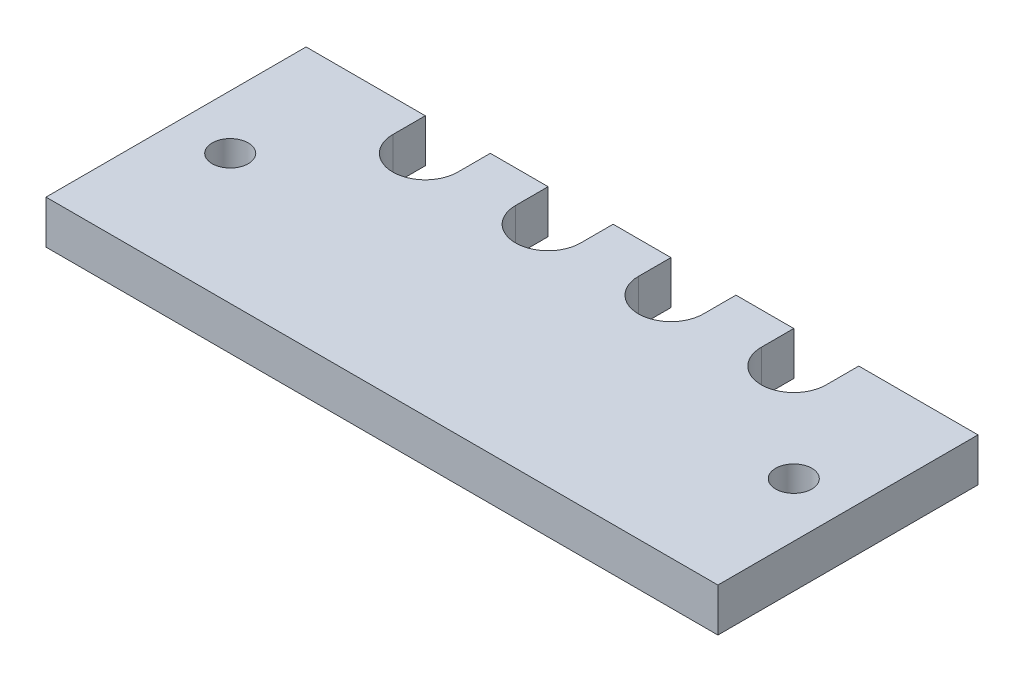
ISO-10303-21;
HEADER;
FILE_DESCRIPTION(('STEP AP214'),'2;1');
FILE_NAME('part.step','',(''),(''),'','','');
FILE_SCHEMA(('AUTOMOTIVE_DESIGN { 1 0 10303 214 1 1 1 1 }'));
ENDSEC;
DATA;
#1=APPLICATION_CONTEXT('core data for automotive mechanical design processes');
#2=APPLICATION_PROTOCOL_DEFINITION('international standard','automotive_design',2000,#1);
#3=PRODUCT_CONTEXT('',#1,'mechanical');
#4=PRODUCT('Part','Part','',(#3));
#5=PRODUCT_RELATED_PRODUCT_CATEGORY('part','',(#4));
#6=PRODUCT_DEFINITION_FORMATION('','',#4);
#7=PRODUCT_DEFINITION_CONTEXT('part definition',#1,'design');
#8=PRODUCT_DEFINITION('design','',#6,#7);
#9=PRODUCT_DEFINITION_SHAPE('','',#8);
#10=(LENGTH_UNIT() NAMED_UNIT(*) SI_UNIT(.MILLI.,.METRE.));
#11=(NAMED_UNIT(*) PLANE_ANGLE_UNIT() SI_UNIT($,.RADIAN.));
#12=(NAMED_UNIT(*) SI_UNIT($,.STERADIAN.) SOLID_ANGLE_UNIT());
#13=UNCERTAINTY_MEASURE_WITH_UNIT(LENGTH_MEASURE(1.E-05),#10,'distance_accuracy_value','');
#14=(GEOMETRIC_REPRESENTATION_CONTEXT(3) GLOBAL_UNCERTAINTY_ASSIGNED_CONTEXT((#13)) GLOBAL_UNIT_ASSIGNED_CONTEXT((#10,
#11,#12)) REPRESENTATION_CONTEXT('',''));
#15=CARTESIAN_POINT('',(0.,0.,0.));
#16=DIRECTION('',(0.,0.,1.));
#17=DIRECTION('',(1.,0.,0.));
#18=AXIS2_PLACEMENT_3D('',#15,#16,#17);
#19=CARTESIAN_POINT('',(-12.75,3.,-6.74999999999982));
#20=DIRECTION('',(0.,-1.,0.));
#21=DIRECTION('',(0.,0.,-1.));
#22=AXIS2_PLACEMENT_3D('',#19,#20,#21);
#23=CYLINDRICAL_SURFACE('',#22,2.25);
#24=CARTESIAN_POINT('',(-12.75,0.,-6.74999999999982));
#25=DIRECTION('',(0.,1.,0.));
#26=DIRECTION('',(0.,0.,1.));
#27=AXIS2_PLACEMENT_3D('',#24,#25,#26);
#28=CIRCLE('',#27,2.25);
#29=CARTESIAN_POINT('',(-15.,0.,-6.74999999999982));
#30=VERTEX_POINT('',#29);
#31=CARTESIAN_POINT('',(-10.5,0.,-6.74999999999982));
#32=VERTEX_POINT('',#31);
#33=EDGE_CURVE('E281',#30,#32,#28,.T.);
#34=ORIENTED_EDGE('',*,*,#33,.F.);
#35=DIRECTION('',(0.,-1.,0.));
#36=VECTOR('',#35,1.);
#37=CARTESIAN_POINT('',(-15.,3.,-6.74999999999982));
#38=LINE('',#37,#36);
#39=CARTESIAN_POINT('',(-15.,3.,-6.74999999999982));
#40=VERTEX_POINT('',#39);
#41=EDGE_CURVE('E11',#40,#30,#38,.T.);
#42=ORIENTED_EDGE('',*,*,#41,.F.);
#43=CARTESIAN_POINT('',(-12.75,3.,-6.74999999999982));
#44=DIRECTION('',(0.,1.,0.));
#45=DIRECTION('',(0.,0.,1.));
#46=AXIS2_PLACEMENT_3D('',#43,#44,#45);
#47=CIRCLE('',#46,2.25);
#48=CARTESIAN_POINT('',(-10.5,3.,-6.74999999999982));
#49=VERTEX_POINT('',#48);
#50=EDGE_CURVE('E232',#40,#49,#47,.T.);
#51=ORIENTED_EDGE('',*,*,#50,.T.);
#52=DIRECTION('',(0.,-1.,0.));
#53=VECTOR('',#52,1.);
#54=CARTESIAN_POINT('',(-10.5,3.,-6.74999999999982));
#55=LINE('',#54,#53);
#56=EDGE_CURVE('E58',#49,#32,#55,.T.);
#57=ORIENTED_EDGE('',*,*,#56,.T.);
#58=EDGE_LOOP('',(#34,#42,#51,#57));
#59=FACE_BOUND('',#58,.T.);
#60=ADVANCED_FACE('F41',(#59),#23,.F.);
#61=CARTESIAN_POINT('',(-15.,3.,0.));
#62=DIRECTION('',(-1.,0.,0.));
#63=DIRECTION('',(0.,0.,1.));
#64=AXIS2_PLACEMENT_3D('',#61,#62,#63);
#65=PLANE('',#64);
#66=DIRECTION('',(0.,0.,-1.));
#67=VECTOR('',#66,1.);
#68=CARTESIAN_POINT('',(-15.,0.,0.));
#69=LINE('',#68,#67);
#70=CARTESIAN_POINT('',(-15.,0.,-9.));
#71=VERTEX_POINT('',#70);
#72=EDGE_CURVE('E284',#30,#71,#69,.T.);
#73=ORIENTED_EDGE('',*,*,#72,.T.);
#74=DIRECTION('',(0.,-1.,0.));
#75=VECTOR('',#74,1.);
#76=CARTESIAN_POINT('',(-15.,3.,-9.));
#77=LINE('',#76,#75);
#78=CARTESIAN_POINT('',(-15.,3.,-9.));
#79=VERTEX_POINT('',#78);
#80=EDGE_CURVE('E50',#79,#71,#77,.T.);
#81=ORIENTED_EDGE('',*,*,#80,.F.);
#82=DIRECTION('',(0.,0.,-1.));
#83=VECTOR('',#82,1.);
#84=CARTESIAN_POINT('',(-15.,3.,0.));
#85=LINE('',#84,#83);
#86=EDGE_CURVE('E224',#40,#79,#85,.T.);
#87=ORIENTED_EDGE('',*,*,#86,.F.);
#88=ORIENTED_EDGE('',*,*,#41,.T.);
#89=EDGE_LOOP('',(#73,#81,#87,#88));
#90=FACE_BOUND('',#89,.T.);
#91=ADVANCED_FACE('F407',(#90),#65,.F.);
#92=CARTESIAN_POINT('',(0.,3.,-9.));
#93=DIRECTION('',(0.,0.,-1.));
#94=DIRECTION('',(-1.,0.,0.));
#95=AXIS2_PLACEMENT_3D('',#92,#93,#94);
#96=PLANE('',#95);
#97=DIRECTION('',(1.,0.,0.));
#98=VECTOR('',#97,1.);
#99=CARTESIAN_POINT('',(0.,0.,-9.));
#100=LINE('',#99,#98);
#101=CARTESIAN_POINT('',(-23.25,0.,-9.));
#102=VERTEX_POINT('',#101);
#103=EDGE_CURVE('E288',#102,#71,#100,.T.);
#104=ORIENTED_EDGE('',*,*,#103,.F.);
#105=DIRECTION('',(0.,-1.,0.));
#106=VECTOR('',#105,1.);
#107=CARTESIAN_POINT('',(-23.25,3.,-9.));
#108=LINE('',#107,#106);
#109=CARTESIAN_POINT('',(-23.25,3.,-9.));
#110=VERTEX_POINT('',#109);
#111=EDGE_CURVE('E399',#110,#102,#108,.T.);
#112=ORIENTED_EDGE('',*,*,#111,.F.);
#113=DIRECTION('',(1.,0.,0.));
#114=VECTOR('',#113,1.);
#115=CARTESIAN_POINT('',(0.,3.,-9.));
#116=LINE('',#115,#114);
#117=EDGE_CURVE('E210',#110,#79,#116,.T.);
#118=ORIENTED_EDGE('',*,*,#117,.T.);
#119=ORIENTED_EDGE('',*,*,#80,.T.);
#120=EDGE_LOOP('',(#104,#112,#118,#119));
#121=FACE_BOUND('',#120,.T.);
#122=ADVANCED_FACE('F404',(#121),#96,.T.);
#123=CARTESIAN_POINT('',(-23.25,3.,0.));
#124=DIRECTION('',(-1.,0.,0.));
#125=DIRECTION('',(0.,0.,1.));
#126=AXIS2_PLACEMENT_3D('',#123,#124,#125);
#127=PLANE('',#126);
#128=DIRECTION('',(0.,0.,-1.));
#129=VECTOR('',#128,1.);
#130=CARTESIAN_POINT('',(-23.25,0.,0.));
#131=LINE('',#130,#129);
#132=CARTESIAN_POINT('',(-23.25,0.,9.));
#133=VERTEX_POINT('',#132);
#134=EDGE_CURVE('E292',#133,#102,#131,.T.);
#135=ORIENTED_EDGE('',*,*,#134,.F.);
#136=DIRECTION('',(0.,-1.,0.));
#137=VECTOR('',#136,1.);
#138=CARTESIAN_POINT('',(-23.25,3.,9.));
#139=LINE('',#138,#137);
#140=CARTESIAN_POINT('',(-23.25,3.,9.));
#141=VERTEX_POINT('',#140);
#142=EDGE_CURVE('E396',#141,#133,#139,.T.);
#143=ORIENTED_EDGE('',*,*,#142,.F.);
#144=DIRECTION('',(0.,0.,-1.));
#145=VECTOR('',#144,1.);
#146=CARTESIAN_POINT('',(-23.25,3.,0.));
#147=LINE('',#146,#145);
#148=EDGE_CURVE('E223',#141,#110,#147,.T.);
#149=ORIENTED_EDGE('',*,*,#148,.T.);
#150=ORIENTED_EDGE('',*,*,#111,.T.);
#151=EDGE_LOOP('',(#135,#143,#149,#150));
#152=FACE_BOUND('',#151,.T.);
#153=ADVANCED_FACE('F415',(#152),#127,.T.);
#154=CARTESIAN_POINT('',(0.,3.,9.));
#155=DIRECTION('',(0.,0.,-1.));
#156=DIRECTION('',(-1.,0.,0.));
#157=AXIS2_PLACEMENT_3D('',#154,#155,#156);
#158=PLANE('',#157);
#159=DIRECTION('',(1.,0.,0.));
#160=VECTOR('',#159,1.);
#161=CARTESIAN_POINT('',(0.,0.,9.));
#162=LINE('',#161,#160);
#163=CARTESIAN_POINT('',(23.25,0.,9.));
#164=VERTEX_POINT('',#163);
#165=EDGE_CURVE('E298',#133,#164,#162,.T.);
#166=ORIENTED_EDGE('',*,*,#165,.T.);
#167=DIRECTION('',(0.,-1.,0.));
#168=VECTOR('',#167,1.);
#169=CARTESIAN_POINT('',(23.25,3.,9.));
#170=LINE('',#169,#168);
#171=CARTESIAN_POINT('',(23.25,3.,9.));
#172=VERTEX_POINT('',#171);
#173=EDGE_CURVE('E392',#172,#164,#170,.T.);
#174=ORIENTED_EDGE('',*,*,#173,.F.);
#175=DIRECTION('',(1.,0.,0.));
#176=VECTOR('',#175,1.);
#177=CARTESIAN_POINT('',(0.,3.,9.));
#178=LINE('',#177,#176);
#179=EDGE_CURVE('E231',#141,#172,#178,.T.);
#180=ORIENTED_EDGE('',*,*,#179,.F.);
#181=ORIENTED_EDGE('',*,*,#142,.T.);
#182=EDGE_LOOP('',(#166,#174,#180,#181));
#183=FACE_BOUND('',#182,.T.);
#184=ADVANCED_FACE('F436',(#183),#158,.F.);
#185=CARTESIAN_POINT('',(23.25,3.,0.));
#186=DIRECTION('',(-1.,0.,0.));
#187=DIRECTION('',(0.,0.,1.));
#188=AXIS2_PLACEMENT_3D('',#185,#186,#187);
#189=PLANE('',#188);
#190=DIRECTION('',(0.,0.,-1.));
#191=VECTOR('',#190,1.);
#192=CARTESIAN_POINT('',(23.25,0.,0.));
#193=LINE('',#192,#191);
#194=CARTESIAN_POINT('',(23.25,0.,-9.));
#195=VERTEX_POINT('',#194);
#196=EDGE_CURVE('E301',#164,#195,#193,.T.);
#197=ORIENTED_EDGE('',*,*,#196,.T.);
#198=DIRECTION('',(0.,-1.,0.));
#199=VECTOR('',#198,1.);
#200=CARTESIAN_POINT('',(23.25,3.,-9.));
#201=LINE('',#200,#199);
#202=CARTESIAN_POINT('',(23.25,3.,-9.));
#203=VERTEX_POINT('',#202);
#204=EDGE_CURVE('E389',#203,#195,#201,.T.);
#205=ORIENTED_EDGE('',*,*,#204,.F.);
#206=DIRECTION('',(0.,0.,-1.));
#207=VECTOR('',#206,1.);
#208=CARTESIAN_POINT('',(23.25,3.,0.));
#209=LINE('',#208,#207);
#210=EDGE_CURVE('E236',#172,#203,#209,.T.);
#211=ORIENTED_EDGE('',*,*,#210,.F.);
#212=ORIENTED_EDGE('',*,*,#173,.T.);
#213=EDGE_LOOP('',(#197,#205,#211,#212));
#214=FACE_BOUND('',#213,.T.);
#215=ADVANCED_FACE('F433',(#214),#189,.F.);
#216=CARTESIAN_POINT('',(15.,0.,-9.));
#217=VERTEX_POINT('',#216);
#218=EDGE_CURVE('E294',#217,#195,#100,.T.);
#219=ORIENTED_EDGE('',*,*,#218,.F.);
#220=DIRECTION('',(0.,-1.,0.));
#221=VECTOR('',#220,1.);
#222=CARTESIAN_POINT('',(15.,3.,-9.));
#223=LINE('',#222,#221);
#224=CARTESIAN_POINT('',(15.,3.,-9.));
#225=VERTEX_POINT('',#224);
#226=EDGE_CURVE('E386',#225,#217,#223,.T.);
#227=ORIENTED_EDGE('',*,*,#226,.F.);
#228=EDGE_CURVE('E225',#225,#203,#116,.T.);
#229=ORIENTED_EDGE('',*,*,#228,.T.);
#230=ORIENTED_EDGE('',*,*,#204,.T.);
#231=EDGE_LOOP('',(#219,#227,#229,#230));
#232=FACE_BOUND('',#231,.T.);
#233=ADVANCED_FACE('F429',(#232),#96,.T.);
#234=CARTESIAN_POINT('',(15.,3.,0.));
#235=DIRECTION('',(-1.,0.,0.));
#236=DIRECTION('',(0.,0.,1.));
#237=AXIS2_PLACEMENT_3D('',#234,#235,#236);
#238=PLANE('',#237);
#239=DIRECTION('',(0.,0.,-1.));
#240=VECTOR('',#239,1.);
#241=CARTESIAN_POINT('',(15.,0.,0.));
#242=LINE('',#241,#240);
#243=CARTESIAN_POINT('',(15.,0.,-6.75));
#244=VERTEX_POINT('',#243);
#245=EDGE_CURVE('E305',#244,#217,#242,.T.);
#246=ORIENTED_EDGE('',*,*,#245,.F.);
#247=DIRECTION('',(0.,-1.,0.));
#248=VECTOR('',#247,1.);
#249=CARTESIAN_POINT('',(15.,3.,-6.75));
#250=LINE('',#249,#248);
#251=CARTESIAN_POINT('',(15.,3.,-6.75));
#252=VERTEX_POINT('',#251);
#253=EDGE_CURVE('E383',#252,#244,#250,.T.);
#254=ORIENTED_EDGE('',*,*,#253,.F.);
#255=DIRECTION('',(0.,0.,-1.));
#256=VECTOR('',#255,1.);
#257=CARTESIAN_POINT('',(15.,3.,0.));
#258=LINE('',#257,#256);
#259=EDGE_CURVE('E235',#252,#225,#258,.T.);
#260=ORIENTED_EDGE('',*,*,#259,.T.);
#261=ORIENTED_EDGE('',*,*,#226,.T.);
#262=EDGE_LOOP('',(#246,#254,#260,#261));
#263=FACE_BOUND('',#262,.T.);
#264=ADVANCED_FACE('F441',(#263),#238,.T.);
#265=CARTESIAN_POINT('',(12.75,3.,-6.75));
#266=DIRECTION('',(0.,-1.,0.));
#267=DIRECTION('',(0.,0.,-1.));
#268=AXIS2_PLACEMENT_3D('',#265,#266,#267);
#269=CYLINDRICAL_SURFACE('',#268,2.25);
#270=CARTESIAN_POINT('',(12.75,0.,-6.75));
#271=DIRECTION('',(0.,1.,0.));
#272=DIRECTION('',(0.,0.,1.));
#273=AXIS2_PLACEMENT_3D('',#270,#271,#272);
#274=CIRCLE('',#273,2.25);
#275=CARTESIAN_POINT('',(10.5,0.,-6.75));
#276=VERTEX_POINT('',#275);
#277=EDGE_CURVE('E309',#276,#244,#274,.T.);
#278=ORIENTED_EDGE('',*,*,#277,.F.);
#279=DIRECTION('',(0.,-1.,0.));
#280=VECTOR('',#279,1.);
#281=CARTESIAN_POINT('',(10.5,3.,-6.75));
#282=LINE('',#281,#280);
#283=CARTESIAN_POINT('',(10.5,3.,-6.75));
#284=VERTEX_POINT('',#283);
#285=EDGE_CURVE('E380',#284,#276,#282,.T.);
#286=ORIENTED_EDGE('',*,*,#285,.F.);
#287=CARTESIAN_POINT('',(12.75,3.,-6.75));
#288=DIRECTION('',(0.,1.,0.));
#289=DIRECTION('',(0.,0.,1.));
#290=AXIS2_PLACEMENT_3D('',#287,#288,#289);
#291=CIRCLE('',#290,2.25);
#292=EDGE_CURVE('E242',#284,#252,#291,.T.);
#293=ORIENTED_EDGE('',*,*,#292,.T.);
#294=ORIENTED_EDGE('',*,*,#253,.T.);
#295=EDGE_LOOP('',(#278,#286,#293,#294));
#296=FACE_BOUND('',#295,.T.);
#297=ADVANCED_FACE('F444',(#296),#269,.F.);
#298=CARTESIAN_POINT('',(10.5,3.,0.));
#299=DIRECTION('',(-1.,0.,0.));
#300=DIRECTION('',(0.,0.,1.));
#301=AXIS2_PLACEMENT_3D('',#298,#299,#300);
#302=PLANE('',#301);
#303=DIRECTION('',(0.,0.,-1.));
#304=VECTOR('',#303,1.);
#305=CARTESIAN_POINT('',(10.5,0.,0.));
#306=LINE('',#305,#304);
#307=CARTESIAN_POINT('',(10.5,0.,-9.));
#308=VERTEX_POINT('',#307);
#309=EDGE_CURVE('E313',#276,#308,#306,.T.);
#310=ORIENTED_EDGE('',*,*,#309,.T.);
#311=DIRECTION('',(0.,-1.,0.));
#312=VECTOR('',#311,1.);
#313=CARTESIAN_POINT('',(10.5,3.,-9.));
#314=LINE('',#313,#312);
#315=CARTESIAN_POINT('',(10.5,3.,-9.));
#316=VERTEX_POINT('',#315);
#317=EDGE_CURVE('E377',#316,#308,#314,.T.);
#318=ORIENTED_EDGE('',*,*,#317,.F.);
#319=DIRECTION('',(0.,0.,-1.));
#320=VECTOR('',#319,1.);
#321=CARTESIAN_POINT('',(10.5,3.,0.));
#322=LINE('',#321,#320);
#323=EDGE_CURVE('E248',#284,#316,#322,.T.);
#324=ORIENTED_EDGE('',*,*,#323,.F.);
#325=ORIENTED_EDGE('',*,*,#285,.T.);
#326=EDGE_LOOP('',(#310,#318,#324,#325));
#327=FACE_BOUND('',#326,.T.);
#328=ADVANCED_FACE('F447',(#327),#302,.F.);
#329=CARTESIAN_POINT('',(6.50000000000001,0.,-9.));
#330=VERTEX_POINT('',#329);
#331=EDGE_CURVE('E317',#330,#308,#100,.T.);
#332=ORIENTED_EDGE('',*,*,#331,.F.);
#333=DIRECTION('',(0.,-1.,0.));
#334=VECTOR('',#333,1.);
#335=CARTESIAN_POINT('',(6.50000000000001,3.,-9.));
#336=LINE('',#335,#334);
#337=CARTESIAN_POINT('',(6.50000000000001,3.,-9.));
#338=VERTEX_POINT('',#337);
#339=EDGE_CURVE('E374',#338,#330,#336,.T.);
#340=ORIENTED_EDGE('',*,*,#339,.F.);
#341=EDGE_CURVE('E220',#338,#316,#116,.T.);
#342=ORIENTED_EDGE('',*,*,#341,.T.);
#343=ORIENTED_EDGE('',*,*,#317,.T.);
#344=EDGE_LOOP('',(#332,#340,#342,#343));
#345=FACE_BOUND('',#344,.T.);
#346=ADVANCED_FACE('F449',(#345),#96,.T.);
#347=CARTESIAN_POINT('',(6.50000000000001,3.,0.));
#348=DIRECTION('',(-1.,0.,0.));
#349=DIRECTION('',(0.,0.,1.));
#350=AXIS2_PLACEMENT_3D('',#347,#348,#349);
#351=PLANE('',#350);
#352=DIRECTION('',(0.,0.,-1.));
#353=VECTOR('',#352,1.);
#354=CARTESIAN_POINT('',(6.50000000000001,0.,0.));
#355=LINE('',#354,#353);
#356=CARTESIAN_POINT('',(6.50000000000001,0.,-6.74999999999994));
#357=VERTEX_POINT('',#356);
#358=EDGE_CURVE('E318',#357,#330,#355,.T.);
#359=ORIENTED_EDGE('',*,*,#358,.F.);
#360=DIRECTION('',(0.,-1.,0.));
#361=VECTOR('',#360,1.);
#362=CARTESIAN_POINT('',(6.50000000000001,3.,-6.74999999999994));
#363=LINE('',#362,#361);
#364=CARTESIAN_POINT('',(6.50000000000001,3.,-6.74999999999994));
#365=VERTEX_POINT('',#364);
#366=EDGE_CURVE('E371',#365,#357,#363,.T.);
#367=ORIENTED_EDGE('',*,*,#366,.F.);
#368=DIRECTION('',(0.,0.,-1.));
#369=VECTOR('',#368,1.);
#370=CARTESIAN_POINT('',(6.50000000000001,3.,0.));
#371=LINE('',#370,#369);
#372=EDGE_CURVE('E247',#365,#338,#371,.T.);
#373=ORIENTED_EDGE('',*,*,#372,.T.);
#374=ORIENTED_EDGE('',*,*,#339,.T.);
#375=EDGE_LOOP('',(#359,#367,#373,#374));
#376=FACE_BOUND('',#375,.T.);
#377=ADVANCED_FACE('F454',(#376),#351,.T.);
#378=CARTESIAN_POINT('',(4.25000000000001,3.,-6.74999999999994));
#379=DIRECTION('',(0.,-1.,0.));
#380=DIRECTION('',(0.,0.,-1.));
#381=AXIS2_PLACEMENT_3D('',#378,#379,#380);
#382=CYLINDRICAL_SURFACE('',#381,2.25);
#383=CARTESIAN_POINT('',(4.25000000000001,0.,-6.74999999999994));
#384=DIRECTION('',(0.,1.,0.));
#385=DIRECTION('',(0.,0.,1.));
#386=AXIS2_PLACEMENT_3D('',#383,#384,#385);
#387=CIRCLE('',#386,2.25);
#388=CARTESIAN_POINT('',(2.00000000000001,0.,-6.74999999999994));
#389=VERTEX_POINT('',#388);
#390=EDGE_CURVE('E322',#389,#357,#387,.T.);
#391=ORIENTED_EDGE('',*,*,#390,.F.);
#392=DIRECTION('',(0.,-1.,0.));
#393=VECTOR('',#392,1.);
#394=CARTESIAN_POINT('',(2.00000000000001,3.,-6.74999999999994));
#395=LINE('',#394,#393);
#396=CARTESIAN_POINT('',(2.00000000000001,3.,-6.74999999999994));
#397=VERTEX_POINT('',#396);
#398=EDGE_CURVE('E368',#397,#389,#395,.T.);
#399=ORIENTED_EDGE('',*,*,#398,.F.);
#400=CARTESIAN_POINT('',(4.25000000000001,3.,-6.74999999999994));
#401=DIRECTION('',(0.,1.,0.));
#402=DIRECTION('',(0.,0.,1.));
#403=AXIS2_PLACEMENT_3D('',#400,#401,#402);
#404=CIRCLE('',#403,2.25);
#405=EDGE_CURVE('E254',#397,#365,#404,.T.);
#406=ORIENTED_EDGE('',*,*,#405,.T.);
#407=ORIENTED_EDGE('',*,*,#366,.T.);
#408=EDGE_LOOP('',(#391,#399,#406,#407));
#409=FACE_BOUND('',#408,.T.);
#410=ADVANCED_FACE('F458',(#409),#382,.F.);
#411=CARTESIAN_POINT('',(2.00000000000001,3.,0.));
#412=DIRECTION('',(-1.,0.,0.));
#413=DIRECTION('',(0.,0.,1.));
#414=AXIS2_PLACEMENT_3D('',#411,#412,#413);
#415=PLANE('',#414);
#416=DIRECTION('',(0.,0.,-1.));
#417=VECTOR('',#416,1.);
#418=CARTESIAN_POINT('',(2.00000000000001,0.,0.));
#419=LINE('',#418,#417);
#420=CARTESIAN_POINT('',(2.00000000000001,0.,-9.));
#421=VERTEX_POINT('',#420);
#422=EDGE_CURVE('E326',#389,#421,#419,.T.);
#423=ORIENTED_EDGE('',*,*,#422,.T.);
#424=DIRECTION('',(0.,-1.,0.));
#425=VECTOR('',#424,1.);
#426=CARTESIAN_POINT('',(2.00000000000001,3.,-9.));
#427=LINE('',#426,#425);
#428=CARTESIAN_POINT('',(2.00000000000001,3.,-9.));
#429=VERTEX_POINT('',#428);
#430=EDGE_CURVE('E365',#429,#421,#427,.T.);
#431=ORIENTED_EDGE('',*,*,#430,.F.);
#432=DIRECTION('',(0.,0.,-1.));
#433=VECTOR('',#432,1.);
#434=CARTESIAN_POINT('',(2.00000000000001,3.,0.));
#435=LINE('',#434,#433);
#436=EDGE_CURVE('E219',#397,#429,#435,.T.);
#437=ORIENTED_EDGE('',*,*,#436,.F.);
#438=ORIENTED_EDGE('',*,*,#398,.T.);
#439=EDGE_LOOP('',(#423,#431,#437,#438));
#440=FACE_BOUND('',#439,.T.);
#441=ADVANCED_FACE('F462',(#440),#415,.F.);
#442=CARTESIAN_POINT('',(-1.99999999999998,0.,-9.));
#443=VERTEX_POINT('',#442);
#444=EDGE_CURVE('E330',#443,#421,#100,.T.);
#445=ORIENTED_EDGE('',*,*,#444,.F.);
#446=DIRECTION('',(0.,-1.,0.));
#447=VECTOR('',#446,1.);
#448=CARTESIAN_POINT('',(-1.99999999999998,3.,-9.));
#449=LINE('',#448,#447);
#450=CARTESIAN_POINT('',(-1.99999999999998,3.,-9.));
#451=VERTEX_POINT('',#450);
#452=EDGE_CURVE('E362',#451,#443,#449,.T.);
#453=ORIENTED_EDGE('',*,*,#452,.F.);
#454=EDGE_CURVE('E209',#451,#429,#116,.T.);
#455=ORIENTED_EDGE('',*,*,#454,.T.);
#456=ORIENTED_EDGE('',*,*,#430,.T.);
#457=EDGE_LOOP('',(#445,#453,#455,#456));
#458=FACE_BOUND('',#457,.T.);
#459=ADVANCED_FACE('F512',(#458),#96,.T.);
#460=CARTESIAN_POINT('',(-1.99999999999998,3.,0.));
#461=DIRECTION('',(-1.,0.,0.));
#462=DIRECTION('',(0.,0.,1.));
#463=AXIS2_PLACEMENT_3D('',#460,#461,#462);
#464=PLANE('',#463);
#465=DIRECTION('',(0.,0.,-1.));
#466=VECTOR('',#465,1.);
#467=CARTESIAN_POINT('',(-1.99999999999998,0.,0.));
#468=LINE('',#467,#466);
#469=CARTESIAN_POINT('',(-1.99999999999998,0.,-6.74999999999988));
#470=VERTEX_POINT('',#469);
#471=EDGE_CURVE('E331',#470,#443,#468,.T.);
#472=ORIENTED_EDGE('',*,*,#471,.F.);
#473=DIRECTION('',(0.,-1.,0.));
#474=VECTOR('',#473,1.);
#475=CARTESIAN_POINT('',(-1.99999999999998,3.,-6.74999999999988));
#476=LINE('',#475,#474);
#477=CARTESIAN_POINT('',(-1.99999999999998,3.,-6.74999999999988));
#478=VERTEX_POINT('',#477);
#479=EDGE_CURVE('E359',#478,#470,#476,.T.);
#480=ORIENTED_EDGE('',*,*,#479,.F.);
#481=DIRECTION('',(0.,0.,-1.));
#482=VECTOR('',#481,1.);
#483=CARTESIAN_POINT('',(-1.99999999999998,3.,0.));
#484=LINE('',#483,#482);
#485=EDGE_CURVE('E218',#478,#451,#484,.T.);
#486=ORIENTED_EDGE('',*,*,#485,.T.);
#487=ORIENTED_EDGE('',*,*,#452,.T.);
#488=EDGE_LOOP('',(#472,#480,#486,#487));
#489=FACE_BOUND('',#488,.T.);
#490=ADVANCED_FACE('F467',(#489),#464,.T.);
#491=CARTESIAN_POINT('',(-4.24999999999998,3.,-6.74999999999988));
#492=DIRECTION('',(0.,-1.,0.));
#493=DIRECTION('',(0.,0.,-1.));
#494=AXIS2_PLACEMENT_3D('',#491,#492,#493);
#495=CYLINDRICAL_SURFACE('',#494,2.25);
#496=CARTESIAN_POINT('',(-4.24999999999998,0.,-6.74999999999988));
#497=DIRECTION('',(0.,1.,0.));
#498=DIRECTION('',(0.,0.,1.));
#499=AXIS2_PLACEMENT_3D('',#496,#497,#498);
#500=CIRCLE('',#499,2.25);
#501=CARTESIAN_POINT('',(-6.49999999999998,0.,-6.74999999999988));
#502=VERTEX_POINT('',#501);
#503=EDGE_CURVE('E335',#502,#470,#500,.T.);
#504=ORIENTED_EDGE('',*,*,#503,.F.);
#505=DIRECTION('',(0.,-1.,0.));
#506=VECTOR('',#505,1.);
#507=CARTESIAN_POINT('',(-6.49999999999998,3.,-6.74999999999988));
#508=LINE('',#507,#506);
#509=CARTESIAN_POINT('',(-6.49999999999998,3.,-6.74999999999988));
#510=VERTEX_POINT('',#509);
#511=EDGE_CURVE('E203',#510,#502,#508,.T.);
#512=ORIENTED_EDGE('',*,*,#511,.F.);
#513=CARTESIAN_POINT('',(-4.24999999999998,3.,-6.74999999999988));
#514=DIRECTION('',(0.,1.,0.));
#515=DIRECTION('',(0.,0.,1.));
#516=AXIS2_PLACEMENT_3D('',#513,#514,#515);
#517=CIRCLE('',#516,2.25);
#518=EDGE_CURVE('E191',#510,#478,#517,.T.);
#519=ORIENTED_EDGE('',*,*,#518,.T.);
#520=ORIENTED_EDGE('',*,*,#479,.T.);
#521=EDGE_LOOP('',(#504,#512,#519,#520));
#522=FACE_BOUND('',#521,.T.);
#523=ADVANCED_FACE('F471',(#522),#495,.F.);
#524=CARTESIAN_POINT('',(-6.49999999999998,3.,0.));
#525=DIRECTION('',(-1.,0.,0.));
#526=DIRECTION('',(0.,0.,1.));
#527=AXIS2_PLACEMENT_3D('',#524,#525,#526);
#528=PLANE('',#527);
#529=DIRECTION('',(0.,0.,-1.));
#530=VECTOR('',#529,1.);
#531=CARTESIAN_POINT('',(-6.49999999999998,0.,0.));
#532=LINE('',#531,#530);
#533=CARTESIAN_POINT('',(-6.49999999999998,0.,-9.));
#534=VERTEX_POINT('',#533);
#535=EDGE_CURVE('E199',#502,#534,#532,.T.);
#536=ORIENTED_EDGE('',*,*,#535,.T.);
#537=DIRECTION('',(0.,-1.,0.));
#538=VECTOR('',#537,1.);
#539=CARTESIAN_POINT('',(-6.49999999999998,3.,-9.));
#540=LINE('',#539,#538);
#541=CARTESIAN_POINT('',(-6.49999999999998,3.,-9.));
#542=VERTEX_POINT('',#541);
#543=EDGE_CURVE('E196',#542,#534,#540,.T.);
#544=ORIENTED_EDGE('',*,*,#543,.F.);
#545=DIRECTION('',(0.,0.,-1.));
#546=VECTOR('',#545,1.);
#547=CARTESIAN_POINT('',(-6.49999999999998,3.,0.));
#548=LINE('',#547,#546);
#549=EDGE_CURVE('E181',#510,#542,#548,.T.);
#550=ORIENTED_EDGE('',*,*,#549,.F.);
#551=ORIENTED_EDGE('',*,*,#511,.T.);
#552=EDGE_LOOP('',(#536,#544,#550,#551));
#553=FACE_BOUND('',#552,.T.);
#554=ADVANCED_FACE('F197',(#553),#528,.F.);
#555=CARTESIAN_POINT('',(-10.5,0.,-9.));
#556=VERTEX_POINT('',#555);
#557=EDGE_CURVE('E293',#556,#534,#100,.T.);
#558=ORIENTED_EDGE('',*,*,#557,.F.);
#559=DIRECTION('',(0.,-1.,0.));
#560=VECTOR('',#559,1.);
#561=CARTESIAN_POINT('',(-10.5,3.,-9.));
#562=LINE('',#561,#560);
#563=CARTESIAN_POINT('',(-10.5,3.,-9.));
#564=VERTEX_POINT('',#563);
#565=EDGE_CURVE('E119',#564,#556,#562,.T.);
#566=ORIENTED_EDGE('',*,*,#565,.F.);
#567=EDGE_CURVE('E188',#564,#542,#116,.T.);
#568=ORIENTED_EDGE('',*,*,#567,.T.);
#569=ORIENTED_EDGE('',*,*,#543,.T.);
#570=EDGE_LOOP('',(#558,#566,#568,#569));
#571=FACE_BOUND('',#570,.T.);
#572=ADVANCED_FACE('F205',(#571),#96,.T.);
#573=CARTESIAN_POINT('',(19.5,3.,0.));
#574=DIRECTION('',(0.,-1.,0.));
#575=DIRECTION('',(0.,0.,-1.));
#576=AXIS2_PLACEMENT_3D('',#573,#574,#575);
#577=CYLINDRICAL_SURFACE('',#576,1.25);
#578=CARTESIAN_POINT('',(19.5,3.,0.));
#579=DIRECTION('',(0.,1.,0.));
#580=DIRECTION('',(0.,0.,1.));
#581=AXIS2_PLACEMENT_3D('',#578,#579,#580);
#582=CIRCLE('',#581,1.25);
#583=CARTESIAN_POINT('',(19.5,3.,1.25));
#584=VERTEX_POINT('',#583);
#585=EDGE_CURVE('E212',#584,#584,#582,.T.);
#586=ORIENTED_EDGE('',*,*,#585,.T.);
#587=EDGE_LOOP('',(#586));
#588=FACE_BOUND('',#587,.T.);
#589=CARTESIAN_POINT('',(19.5,0.,0.));
#590=DIRECTION('',(0.,1.,0.));
#591=DIRECTION('',(0.,0.,1.));
#592=AXIS2_PLACEMENT_3D('',#589,#590,#591);
#593=CIRCLE('',#592,1.25);
#594=CARTESIAN_POINT('',(19.5,0.,1.25));
#595=VERTEX_POINT('',#594);
#596=EDGE_CURVE('E345',#595,#595,#593,.T.);
#597=ORIENTED_EDGE('',*,*,#596,.F.);
#598=EDGE_LOOP('',(#597));
#599=FACE_BOUND('',#598,.T.);
#600=ADVANCED_FACE('F475',(#588,#599),#577,.F.);
#601=CARTESIAN_POINT('',(-10.5,3.,0.));
#602=DIRECTION('',(-1.,0.,0.));
#603=DIRECTION('',(0.,0.,1.));
#604=AXIS2_PLACEMENT_3D('',#601,#602,#603);
#605=PLANE('',#604);
#606=DIRECTION('',(0.,0.,-1.));
#607=VECTOR('',#606,1.);
#608=CARTESIAN_POINT('',(-10.5,0.,0.));
#609=LINE('',#608,#607);
#610=EDGE_CURVE('E341',#32,#556,#609,.T.);
#611=ORIENTED_EDGE('',*,*,#610,.F.);
#612=ORIENTED_EDGE('',*,*,#56,.F.);
#613=DIRECTION('',(0.,0.,-1.));
#614=VECTOR('',#613,1.);
#615=CARTESIAN_POINT('',(-10.5,3.,0.));
#616=LINE('',#615,#614);
#617=EDGE_CURVE('E207',#49,#564,#616,.T.);
#618=ORIENTED_EDGE('',*,*,#617,.T.);
#619=ORIENTED_EDGE('',*,*,#565,.T.);
#620=EDGE_LOOP('',(#611,#612,#618,#619));
#621=FACE_BOUND('',#620,.T.);
#622=ADVANCED_FACE('F472',(#621),#605,.T.);
#623=CARTESIAN_POINT('',(-19.5,3.,0.));
#624=DIRECTION('',(0.,-1.,0.));
#625=DIRECTION('',(0.,0.,-1.));
#626=AXIS2_PLACEMENT_3D('',#623,#624,#625);
#627=CYLINDRICAL_SURFACE('',#626,1.25);
#628=CARTESIAN_POINT('',(-19.5,3.,0.));
#629=DIRECTION('',(0.,1.,0.));
#630=DIRECTION('',(0.,0.,1.));
#631=AXIS2_PLACEMENT_3D('',#628,#629,#630);
#632=CIRCLE('',#631,1.25);
#633=CARTESIAN_POINT('',(-19.5,3.,1.25));
#634=VERTEX_POINT('',#633);
#635=EDGE_CURVE('E277',#634,#634,#632,.F.);
#636=ORIENTED_EDGE('',*,*,#635,.F.);
#637=EDGE_LOOP('',(#636));
#638=FACE_BOUND('',#637,.T.);
#639=CARTESIAN_POINT('',(-19.5,0.,0.));
#640=DIRECTION('',(0.,1.,0.));
#641=DIRECTION('',(0.,0.,1.));
#642=AXIS2_PLACEMENT_3D('',#639,#640,#641);
#643=CIRCLE('',#642,1.25);
#644=CARTESIAN_POINT('',(-19.5,0.,1.25));
#645=VERTEX_POINT('',#644);
#646=EDGE_CURVE('E349',#645,#645,#643,.F.);
#647=ORIENTED_EDGE('',*,*,#646,.T.);
#648=EDGE_LOOP('',(#647));
#649=FACE_BOUND('',#648,.T.);
#650=ADVANCED_FACE('F474',(#638,#649),#627,.F.);
#651=CARTESIAN_POINT('',(0.,3.,0.));
#652=DIRECTION('',(0.,1.,0.));
#653=DIRECTION('',(0.,0.,1.));
#654=AXIS2_PLACEMENT_3D('',#651,#652,#653);
#655=PLANE('',#654);
#656=ORIENTED_EDGE('',*,*,#50,.F.);
#657=ORIENTED_EDGE('',*,*,#86,.T.);
#658=ORIENTED_EDGE('',*,*,#117,.F.);
#659=ORIENTED_EDGE('',*,*,#148,.F.);
#660=ORIENTED_EDGE('',*,*,#179,.T.);
#661=ORIENTED_EDGE('',*,*,#210,.T.);
#662=ORIENTED_EDGE('',*,*,#228,.F.);
#663=ORIENTED_EDGE('',*,*,#259,.F.);
#664=ORIENTED_EDGE('',*,*,#292,.F.);
#665=ORIENTED_EDGE('',*,*,#323,.T.);
#666=ORIENTED_EDGE('',*,*,#341,.F.);
#667=ORIENTED_EDGE('',*,*,#372,.F.);
#668=ORIENTED_EDGE('',*,*,#405,.F.);
#669=ORIENTED_EDGE('',*,*,#436,.T.);
#670=ORIENTED_EDGE('',*,*,#454,.F.);
#671=ORIENTED_EDGE('',*,*,#485,.F.);
#672=ORIENTED_EDGE('',*,*,#518,.F.);
#673=ORIENTED_EDGE('',*,*,#549,.T.);
#674=ORIENTED_EDGE('',*,*,#567,.F.);
#675=ORIENTED_EDGE('',*,*,#617,.F.);
#676=EDGE_LOOP('',(#656,#657,#658,#659,#660,#661,#662,#663,#664,#665,#666,#667,#668,#669,#670,
#671,#672,#673,#674,#675));
#677=FACE_BOUND('',#676,.T.);
#678=ORIENTED_EDGE('',*,*,#585,.F.);
#679=EDGE_LOOP('',(#678));
#680=FACE_BOUND('',#679,.T.);
#681=ORIENTED_EDGE('',*,*,#635,.T.);
#682=EDGE_LOOP('',(#681));
#683=FACE_BOUND('',#682,.T.);
#684=ADVANCED_FACE('F184',(#677,#680,#683),#655,.T.);
#685=CARTESIAN_POINT('',(0.,0.,0.));
#686=DIRECTION('',(0.,1.,0.));
#687=DIRECTION('',(0.,0.,1.));
#688=AXIS2_PLACEMENT_3D('',#685,#686,#687);
#689=PLANE('',#688);
#690=ORIENTED_EDGE('',*,*,#33,.T.);
#691=ORIENTED_EDGE('',*,*,#610,.T.);
#692=ORIENTED_EDGE('',*,*,#557,.T.);
#693=ORIENTED_EDGE('',*,*,#535,.F.);
#694=ORIENTED_EDGE('',*,*,#503,.T.);
#695=ORIENTED_EDGE('',*,*,#471,.T.);
#696=ORIENTED_EDGE('',*,*,#444,.T.);
#697=ORIENTED_EDGE('',*,*,#422,.F.);
#698=ORIENTED_EDGE('',*,*,#390,.T.);
#699=ORIENTED_EDGE('',*,*,#358,.T.);
#700=ORIENTED_EDGE('',*,*,#331,.T.);
#701=ORIENTED_EDGE('',*,*,#309,.F.);
#702=ORIENTED_EDGE('',*,*,#277,.T.);
#703=ORIENTED_EDGE('',*,*,#245,.T.);
#704=ORIENTED_EDGE('',*,*,#218,.T.);
#705=ORIENTED_EDGE('',*,*,#196,.F.);
#706=ORIENTED_EDGE('',*,*,#165,.F.);
#707=ORIENTED_EDGE('',*,*,#134,.T.);
#708=ORIENTED_EDGE('',*,*,#103,.T.);
#709=ORIENTED_EDGE('',*,*,#72,.F.);
#710=EDGE_LOOP('',(#690,#691,#692,#693,#694,#695,#696,#697,#698,#699,#700,#701,#702,#703,#704,
#705,#706,#707,#708,#709));
#711=FACE_BOUND('',#710,.T.);
#712=ORIENTED_EDGE('',*,*,#596,.T.);
#713=EDGE_LOOP('',(#712));
#714=FACE_BOUND('',#713,.T.);
#715=ORIENTED_EDGE('',*,*,#646,.F.);
#716=EDGE_LOOP('',(#715));
#717=FACE_BOUND('',#716,.T.);
#718=ADVANCED_FACE('F409',(#711,#714,#717),#689,.F.);
#719=CLOSED_SHELL('',(#60,#91,#122,#153,#184,#215,#233,#264,#297,#328,#346,#377,#410,#441,#459,
#490,#523,#554,#572,#600,#622,#650,#684,#718));
#720=MANIFOLD_SOLID_BREP('B2',#719);
#721=ADVANCED_BREP_SHAPE_REPRESENTATION('',(#18,#720),#14);
#722=SHAPE_DEFINITION_REPRESENTATION(#9,#721);
ENDSEC;
END-ISO-10303-21;
